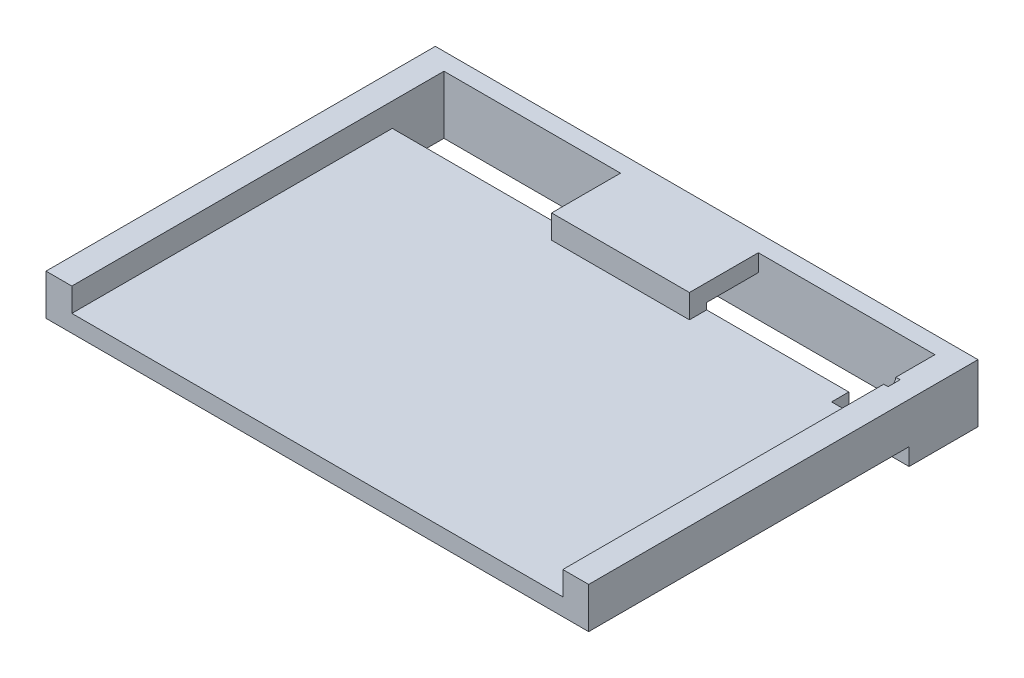
ISO-10303-21;
HEADER;
FILE_DESCRIPTION(('STEP AP214'),'2;1');
FILE_NAME('part.step','',(''),(''),'','','');
FILE_SCHEMA(('AUTOMOTIVE_DESIGN { 1 0 10303 214 1 1 1 1 }'));
ENDSEC;
DATA;
#1=APPLICATION_CONTEXT('core data for automotive mechanical design processes');
#2=APPLICATION_PROTOCOL_DEFINITION('international standard','automotive_design',2000,#1);
#3=PRODUCT_CONTEXT('',#1,'mechanical');
#4=PRODUCT('Part','Part','',(#3));
#5=PRODUCT_RELATED_PRODUCT_CATEGORY('part','',(#4));
#6=PRODUCT_DEFINITION_FORMATION('','',#4);
#7=PRODUCT_DEFINITION_CONTEXT('part definition',#1,'design');
#8=PRODUCT_DEFINITION('design','',#6,#7);
#9=PRODUCT_DEFINITION_SHAPE('','',#8);
#10=(LENGTH_UNIT() NAMED_UNIT(*) SI_UNIT(.MILLI.,.METRE.));
#11=(NAMED_UNIT(*) PLANE_ANGLE_UNIT() SI_UNIT($,.RADIAN.));
#12=(NAMED_UNIT(*) SI_UNIT($,.STERADIAN.) SOLID_ANGLE_UNIT());
#13=UNCERTAINTY_MEASURE_WITH_UNIT(LENGTH_MEASURE(1.E-05),#10,'distance_accuracy_value','');
#14=(GEOMETRIC_REPRESENTATION_CONTEXT(3) GLOBAL_UNCERTAINTY_ASSIGNED_CONTEXT((#13)) GLOBAL_UNIT_ASSIGNED_CONTEXT((#10,
#11,#12)) REPRESENTATION_CONTEXT('',''));
#15=CARTESIAN_POINT('',(0.,0.,0.));
#16=DIRECTION('',(0.,0.,1.));
#17=DIRECTION('',(1.,0.,0.));
#18=AXIS2_PLACEMENT_3D('',#15,#16,#17);
#19=CARTESIAN_POINT('',(0.,6.75,0.));
#20=DIRECTION('',(0.,1.,0.));
#21=DIRECTION('',(0.,0.,1.));
#22=AXIS2_PLACEMENT_3D('',#19,#20,#21);
#23=PLANE('',#22);
#24=DIRECTION('',(0.,0.,-1.));
#25=VECTOR('',#24,1.);
#26=CARTESIAN_POINT('',(28.5,6.75,-20.6));
#27=LINE('',#26,#25);
#28=CARTESIAN_POINT('',(28.5,6.75,-16.0573118588748));
#29=VERTEX_POINT('',#28);
#30=CARTESIAN_POINT('',(28.5,6.75,-20.6));
#31=VERTEX_POINT('',#30);
#32=EDGE_CURVE('E251',#29,#31,#27,.T.);
#33=ORIENTED_EDGE('',*,*,#32,.F.);
#34=DIRECTION('',(-1.,0.,0.));
#35=VECTOR('',#34,1.);
#36=CARTESIAN_POINT('',(29.,6.75,-16.0573118588748));
#37=LINE('',#36,#35);
#38=CARTESIAN_POINT('',(29.,6.75,-16.0573118588748));
#39=VERTEX_POINT('',#38);
#40=EDGE_CURVE('E52',#29,#39,#37,.F.);
#41=ORIENTED_EDGE('',*,*,#40,.T.);
#42=DIRECTION('',(0.,0.,-1.));
#43=VECTOR('',#42,1.);
#44=CARTESIAN_POINT('',(29.,6.75,0.));
#45=LINE('',#44,#43);
#46=CARTESIAN_POINT('',(29.,6.75,-14.6608878544979));
#47=VERTEX_POINT('',#46);
#48=EDGE_CURVE('E12',#47,#39,#45,.T.);
#49=ORIENTED_EDGE('',*,*,#48,.F.);
#50=DIRECTION('',(-1.,0.,0.));
#51=VECTOR('',#50,1.);
#52=CARTESIAN_POINT('',(29.,6.75,-14.6608878544979));
#53=LINE('',#52,#51);
#54=CARTESIAN_POINT('',(28.5,6.75,-14.6608878544979));
#55=VERTEX_POINT('',#54);
#56=EDGE_CURVE('E236',#47,#55,#53,.T.);
#57=ORIENTED_EDGE('',*,*,#56,.T.);
#58=CARTESIAN_POINT('',(28.5,6.75,22.6));
#59=VERTEX_POINT('',#58);
#60=EDGE_CURVE('E376',#59,#55,#27,.T.);
#61=ORIENTED_EDGE('',*,*,#60,.F.);
#62=DIRECTION('',(1.,0.,0.));
#63=VECTOR('',#62,1.);
#64=CARTESIAN_POINT('',(-31.5,6.75,22.6));
#65=LINE('',#64,#63);
#66=CARTESIAN_POINT('',(31.5,6.75,22.6));
#67=VERTEX_POINT('',#66);
#68=EDGE_CURVE('E436',#59,#67,#65,.T.);
#69=ORIENTED_EDGE('',*,*,#68,.T.);
#70=DIRECTION('',(0.,0.,-1.));
#71=VECTOR('',#70,1.);
#72=CARTESIAN_POINT('',(31.5,6.75,-22.6));
#73=LINE('',#72,#71);
#74=CARTESIAN_POINT('',(31.5,6.75,-22.6));
#75=VERTEX_POINT('',#74);
#76=EDGE_CURVE('E441',#67,#75,#73,.T.);
#77=ORIENTED_EDGE('',*,*,#76,.T.);
#78=DIRECTION('',(-1.,0.,0.));
#79=VECTOR('',#78,1.);
#80=CARTESIAN_POINT('',(-31.5,6.75,-22.6));
#81=LINE('',#80,#79);
#82=CARTESIAN_POINT('',(-31.5,6.75,-22.6));
#83=VERTEX_POINT('',#82);
#84=EDGE_CURVE('E443',#75,#83,#81,.T.);
#85=ORIENTED_EDGE('',*,*,#84,.T.);
#86=DIRECTION('',(0.,0.,1.));
#87=VECTOR('',#86,1.);
#88=CARTESIAN_POINT('',(-31.5,6.75,-22.6));
#89=LINE('',#88,#87);
#90=CARTESIAN_POINT('',(-31.5,6.75,22.6));
#91=VERTEX_POINT('',#90);
#92=EDGE_CURVE('E433',#83,#91,#89,.T.);
#93=ORIENTED_EDGE('',*,*,#92,.T.);
#94=CARTESIAN_POINT('',(-28.5,6.75,22.6));
#95=VERTEX_POINT('',#94);
#96=EDGE_CURVE('E438',#91,#95,#65,.T.);
#97=ORIENTED_EDGE('',*,*,#96,.T.);
#98=DIRECTION('',(0.,0.,1.));
#99=VECTOR('',#98,1.);
#100=CARTESIAN_POINT('',(-28.5,6.75,-20.6));
#101=LINE('',#100,#99);
#102=CARTESIAN_POINT('',(-28.5,6.75,-20.6));
#103=VERTEX_POINT('',#102);
#104=EDGE_CURVE('E361',#103,#95,#101,.T.);
#105=ORIENTED_EDGE('',*,*,#104,.F.);
#106=DIRECTION('',(-1.,0.,0.));
#107=VECTOR('',#106,1.);
#108=CARTESIAN_POINT('',(-28.5,6.75,-20.6));
#109=LINE('',#108,#107);
#110=CARTESIAN_POINT('',(-8.,6.75,-20.6));
#111=VERTEX_POINT('',#110);
#112=EDGE_CURVE('E362',#111,#103,#109,.T.);
#113=ORIENTED_EDGE('',*,*,#112,.F.);
#114=DIRECTION('',(0.,0.,-1.));
#115=VECTOR('',#114,1.);
#116=CARTESIAN_POINT('',(-8.,6.75,-20.6));
#117=LINE('',#116,#115);
#118=CARTESIAN_POINT('',(-8.,6.75,-12.6));
#119=VERTEX_POINT('',#118);
#120=EDGE_CURVE('E365',#119,#111,#117,.T.);
#121=ORIENTED_EDGE('',*,*,#120,.F.);
#122=DIRECTION('',(-1.,0.,0.));
#123=VECTOR('',#122,1.);
#124=CARTESIAN_POINT('',(-8.,6.75,-12.6));
#125=LINE('',#124,#123);
#126=CARTESIAN_POINT('',(8.,6.75,-12.6));
#127=VERTEX_POINT('',#126);
#128=EDGE_CURVE('E368',#127,#119,#125,.T.);
#129=ORIENTED_EDGE('',*,*,#128,.F.);
#130=DIRECTION('',(0.,0.,1.));
#131=VECTOR('',#130,1.);
#132=CARTESIAN_POINT('',(8.,6.75,-20.6));
#133=LINE('',#132,#131);
#134=CARTESIAN_POINT('',(8.,6.75,-20.6));
#135=VERTEX_POINT('',#134);
#136=EDGE_CURVE('E371',#135,#127,#133,.T.);
#137=ORIENTED_EDGE('',*,*,#136,.F.);
#138=DIRECTION('',(-1.,0.,0.));
#139=VECTOR('',#138,1.);
#140=CARTESIAN_POINT('',(8.,6.75,-20.6));
#141=LINE('',#140,#139);
#142=EDGE_CURVE('E373',#31,#135,#141,.T.);
#143=ORIENTED_EDGE('',*,*,#142,.F.);
#144=EDGE_LOOP('',(#33,#41,#49,#57,#61,#69,#77,#85,#93,#97,#105,#113,#121,#129,#137,#143));
#145=FACE_BOUND('',#144,.T.);
#146=ADVANCED_FACE('F37',(#145),#23,.T.);
#147=CARTESIAN_POINT('',(28.5,-69.5209060345295,-20.6));
#148=DIRECTION('',(1.,0.,0.));
#149=DIRECTION('',(0.,0.,-1.));
#150=AXIS2_PLACEMENT_3D('',#147,#148,#149);
#151=PLANE('',#150);
#152=CARTESIAN_POINT('',(28.5,6.8,-15.3590998566864));
#153=DIRECTION('',(1.,0.,0.));
#154=DIRECTION('',(0.,0.,-1.));
#155=AXIS2_PLACEMENT_3D('',#152,#153,#154);
#156=CIRCLE('',#155,0.699999999999996);
#157=EDGE_CURVE('E240',#55,#29,#156,.T.);
#158=ORIENTED_EDGE('',*,*,#157,.T.);
#159=ORIENTED_EDGE('',*,*,#32,.T.);
#160=DIRECTION('',(0.,1.,0.));
#161=VECTOR('',#160,1.);
#162=CARTESIAN_POINT('',(28.5,-69.5209060345295,-20.6));
#163=LINE('',#162,#161);
#164=CARTESIAN_POINT('',(28.5,0.,-20.6));
#165=VERTEX_POINT('',#164);
#166=EDGE_CURVE('E401',#165,#31,#163,.T.);
#167=ORIENTED_EDGE('',*,*,#166,.F.);
#168=DIRECTION('',(0.,-0.998629534754574,-0.0523359562429434));
#169=VECTOR('',#168,1.);
#170=CARTESIAN_POINT('',(28.5,4.75,-20.3510630484056));
#171=LINE('',#170,#169);
#172=CARTESIAN_POINT('',(28.5,4.75,-20.3510630484056));
#173=VERTEX_POINT('',#172);
#174=EDGE_CURVE('E315',#173,#165,#171,.T.);
#175=ORIENTED_EDGE('',*,*,#174,.F.);
#176=CARTESIAN_POINT('',(28.5,4.75,-19.2260630484056));
#177=DIRECTION('',(-1.,0.,0.));
#178=DIRECTION('',(0.,0.,1.));
#179=AXIS2_PLACEMENT_3D('',#176,#177,#178);
#180=CIRCLE('',#179,1.125);
#181=CARTESIAN_POINT('',(28.5,4.75,-18.1010630484056));
#182=VERTEX_POINT('',#181);
#183=EDGE_CURVE('E300',#182,#173,#180,.T.);
#184=ORIENTED_EDGE('',*,*,#183,.F.);
#185=DIRECTION('',(0.,0.998629534754574,-0.0523359562429434));
#186=VECTOR('',#185,1.);
#187=CARTESIAN_POINT('',(28.5,4.75,-18.1010630484056));
#188=LINE('',#187,#186);
#189=CARTESIAN_POINT('',(28.5,0.,-17.8521260968111));
#190=VERTEX_POINT('',#189);
#191=EDGE_CURVE('E305',#190,#182,#188,.T.);
#192=ORIENTED_EDGE('',*,*,#191,.F.);
#193=DIRECTION('',(0.,0.,1.));
#194=VECTOR('',#193,1.);
#195=CARTESIAN_POINT('',(28.5,0.,-20.6));
#196=LINE('',#195,#194);
#197=CARTESIAN_POINT('',(28.5,0.,-16.5690153801852));
#198=VERTEX_POINT('',#197);
#199=EDGE_CURVE('E345',#190,#198,#196,.T.);
#200=ORIENTED_EDGE('',*,*,#199,.T.);
#201=DIRECTION('',(0.,-0.998629534754574,-0.052335956242944));
#202=VECTOR('',#201,1.);
#203=CARTESIAN_POINT('',(28.5,2.29186876499435,-16.4489036278037));
#204=LINE('',#203,#202);
#205=CARTESIAN_POINT('',(28.5,2.29186876499435,-16.4489036278037));
#206=VERTEX_POINT('',#205);
#207=EDGE_CURVE('E262',#206,#198,#204,.T.);
#208=ORIENTED_EDGE('',*,*,#207,.F.);
#209=CARTESIAN_POINT('',(28.5,2.25,-15.65));
#210=DIRECTION('',(-1.,0.,0.));
#211=DIRECTION('',(0.,0.,1.));
#212=AXIS2_PLACEMENT_3D('',#209,#210,#211);
#213=CIRCLE('',#212,0.799999999999997);
#214=CARTESIAN_POINT('',(28.5,2.63509684406864,-14.948786465698));
#215=VERTEX_POINT('',#214);
#216=EDGE_CURVE('E255',#215,#206,#213,.T.);
#217=ORIENTED_EDGE('',*,*,#216,.F.);
#218=DIRECTION('',(0.,0.876516917877563,-0.481371055085802));
#219=VECTOR('',#218,1.);
#220=CARTESIAN_POINT('',(28.5,2.,-14.6));
#221=LINE('',#220,#219);
#222=CARTESIAN_POINT('',(28.5,2.,-14.6));
#223=VERTEX_POINT('',#222);
#224=EDGE_CURVE('E252',#223,#215,#221,.T.);
#225=ORIENTED_EDGE('',*,*,#224,.F.);
#226=DIRECTION('',(0.,0.,1.));
#227=VECTOR('',#226,1.);
#228=CARTESIAN_POINT('',(28.5,2.,0.));
#229=LINE('',#228,#227);
#230=CARTESIAN_POINT('',(28.5,2.,-12.6));
#231=VERTEX_POINT('',#230);
#232=EDGE_CURVE('E293',#223,#231,#229,.T.);
#233=ORIENTED_EDGE('',*,*,#232,.T.);
#234=DIRECTION('',(0.,1.,0.));
#235=VECTOR('',#234,1.);
#236=CARTESIAN_POINT('',(28.5,0.,-12.6));
#237=LINE('',#236,#235);
#238=CARTESIAN_POINT('',(28.5,4.,-12.6));
#239=VERTEX_POINT('',#238);
#240=EDGE_CURVE('E291',#231,#239,#237,.T.);
#241=ORIENTED_EDGE('',*,*,#240,.T.);
#242=DIRECTION('',(0.,0.,-1.));
#243=VECTOR('',#242,1.);
#244=CARTESIAN_POINT('',(28.5,4.,-20.6));
#245=LINE('',#244,#243);
#246=CARTESIAN_POINT('',(28.5,3.99999999999998,22.6));
#247=VERTEX_POINT('',#246);
#248=EDGE_CURVE('E398',#247,#239,#245,.T.);
#249=ORIENTED_EDGE('',*,*,#248,.F.);
#250=DIRECTION('',(0.,1.,0.));
#251=VECTOR('',#250,1.);
#252=CARTESIAN_POINT('',(28.5,-69.5209060345295,22.6));
#253=LINE('',#252,#251);
#254=EDGE_CURVE('E381',#247,#59,#253,.T.);
#255=ORIENTED_EDGE('',*,*,#254,.T.);
#256=ORIENTED_EDGE('',*,*,#60,.T.);
#257=EDGE_LOOP('',(#158,#159,#167,#175,#184,#192,#200,#208,#217,#225,#233,#241,#249,#255,#256));
#258=FACE_BOUND('',#257,.T.);
#259=ADVANCED_FACE('F483',(#258),#151,.F.);
#260=CARTESIAN_POINT('',(31.5,2.,-14.6));
#261=DIRECTION('',(0.,0.,-1.));
#262=DIRECTION('',(-1.,0.,0.));
#263=AXIS2_PLACEMENT_3D('',#260,#261,#262);
#264=PLANE('',#263);
#265=DIRECTION('',(0.,1.,0.));
#266=VECTOR('',#265,1.);
#267=CARTESIAN_POINT('',(29.,2.,-14.6));
#268=LINE('',#267,#266);
#269=CARTESIAN_POINT('',(29.,0.,-14.6));
#270=VERTEX_POINT('',#269);
#271=CARTESIAN_POINT('',(29.,2.,-14.6));
#272=VERTEX_POINT('',#271);
#273=EDGE_CURVE('E261',#270,#272,#268,.T.);
#274=ORIENTED_EDGE('',*,*,#273,.F.);
#275=DIRECTION('',(1.,0.,0.));
#276=VECTOR('',#275,1.);
#277=CARTESIAN_POINT('',(31.5,0.,-14.6));
#278=LINE('',#277,#276);
#279=CARTESIAN_POINT('',(31.5,0.,-14.6));
#280=VERTEX_POINT('',#279);
#281=EDGE_CURVE('E414',#270,#280,#278,.T.);
#282=ORIENTED_EDGE('',*,*,#281,.T.);
#283=DIRECTION('',(0.,-1.,0.));
#284=VECTOR('',#283,1.);
#285=CARTESIAN_POINT('',(31.5,2.,-14.6));
#286=LINE('',#285,#284);
#287=CARTESIAN_POINT('',(31.5,2.,-14.6));
#288=VERTEX_POINT('',#287);
#289=EDGE_CURVE('E428',#288,#280,#286,.T.);
#290=ORIENTED_EDGE('',*,*,#289,.F.);
#291=DIRECTION('',(1.,0.,0.));
#292=VECTOR('',#291,1.);
#293=CARTESIAN_POINT('',(31.5,2.,-14.6));
#294=LINE('',#293,#292);
#295=EDGE_CURVE('E422',#272,#288,#294,.T.);
#296=ORIENTED_EDGE('',*,*,#295,.F.);
#297=EDGE_LOOP('',(#274,#282,#290,#296));
#298=FACE_BOUND('',#297,.T.);
#299=ADVANCED_FACE('F495',(#298),#264,.F.);
#300=CARTESIAN_POINT('',(-31.5,0.,-14.6));
#301=VERTEX_POINT('',#300);
#302=CARTESIAN_POINT('',(-28.5,0.,-14.6));
#303=VERTEX_POINT('',#302);
#304=EDGE_CURVE('E418',#301,#303,#278,.T.);
#305=ORIENTED_EDGE('',*,*,#304,.T.);
#306=DIRECTION('',(0.,-1.,0.));
#307=VECTOR('',#306,1.);
#308=CARTESIAN_POINT('',(-28.5,6.75,-14.6));
#309=LINE('',#308,#307);
#310=CARTESIAN_POINT('',(-28.5,2.,-14.6));
#311=VERTEX_POINT('',#310);
#312=EDGE_CURVE('E355',#311,#303,#309,.T.);
#313=ORIENTED_EDGE('',*,*,#312,.F.);
#314=CARTESIAN_POINT('',(-31.5,2.,-14.6));
#315=VERTEX_POINT('',#314);
#316=EDGE_CURVE('E423',#315,#311,#294,.T.);
#317=ORIENTED_EDGE('',*,*,#316,.F.);
#318=DIRECTION('',(0.,-1.,0.));
#319=VECTOR('',#318,1.);
#320=CARTESIAN_POINT('',(-31.5,2.,-14.6));
#321=LINE('',#320,#319);
#322=EDGE_CURVE('E425',#315,#301,#321,.T.);
#323=ORIENTED_EDGE('',*,*,#322,.T.);
#324=EDGE_LOOP('',(#305,#313,#317,#323));
#325=FACE_BOUND('',#324,.T.);
#326=ADVANCED_FACE('F516',(#325),#264,.F.);
#327=CARTESIAN_POINT('',(-31.5,6.75,22.6));
#328=DIRECTION('',(0.,0.,-1.));
#329=DIRECTION('',(-1.,0.,0.));
#330=AXIS2_PLACEMENT_3D('',#327,#328,#329);
#331=PLANE('',#330);
#332=ORIENTED_EDGE('',*,*,#68,.F.);
#333=ORIENTED_EDGE('',*,*,#254,.F.);
#334=DIRECTION('',(1.,0.,0.));
#335=VECTOR('',#334,1.);
#336=CARTESIAN_POINT('',(-28.5,4.,22.6));
#337=LINE('',#336,#335);
#338=CARTESIAN_POINT('',(-28.5,4.,22.6));
#339=VERTEX_POINT('',#338);
#340=EDGE_CURVE('E364',#339,#247,#337,.T.);
#341=ORIENTED_EDGE('',*,*,#340,.F.);
#342=DIRECTION('',(0.,1.,0.));
#343=VECTOR('',#342,1.);
#344=CARTESIAN_POINT('',(-28.5,-69.5209060345295,22.6));
#345=LINE('',#344,#343);
#346=EDGE_CURVE('E384',#339,#95,#345,.T.);
#347=ORIENTED_EDGE('',*,*,#346,.T.);
#348=ORIENTED_EDGE('',*,*,#96,.F.);
#349=DIRECTION('',(0.,-1.,0.));
#350=VECTOR('',#349,1.);
#351=CARTESIAN_POINT('',(-31.5,6.75,22.6));
#352=LINE('',#351,#350);
#353=CARTESIAN_POINT('',(-31.5,2.,22.6));
#354=VERTEX_POINT('',#353);
#355=EDGE_CURVE('E459',#91,#354,#352,.T.);
#356=ORIENTED_EDGE('',*,*,#355,.T.);
#357=DIRECTION('',(-1.,0.,0.));
#358=VECTOR('',#357,1.);
#359=CARTESIAN_POINT('',(31.5,2.,22.6));
#360=LINE('',#359,#358);
#361=CARTESIAN_POINT('',(31.5,2.,22.6));
#362=VERTEX_POINT('',#361);
#363=EDGE_CURVE('E417',#362,#354,#360,.T.);
#364=ORIENTED_EDGE('',*,*,#363,.F.);
#365=DIRECTION('',(0.,-1.,0.));
#366=VECTOR('',#365,1.);
#367=CARTESIAN_POINT('',(31.5,6.75,22.6));
#368=LINE('',#367,#366);
#369=EDGE_CURVE('E456',#67,#362,#368,.T.);
#370=ORIENTED_EDGE('',*,*,#369,.F.);
#371=EDGE_LOOP('',(#332,#333,#341,#347,#348,#356,#364,#370));
#372=FACE_BOUND('',#371,.T.);
#373=ADVANCED_FACE('F505',(#372),#331,.F.);
#374=CARTESIAN_POINT('',(-31.5,6.75,-22.6));
#375=DIRECTION('',(1.,0.,0.));
#376=DIRECTION('',(0.,0.,-1.));
#377=AXIS2_PLACEMENT_3D('',#374,#375,#376);
#378=PLANE('',#377);
#379=DIRECTION('',(0.,0.,1.));
#380=VECTOR('',#379,1.);
#381=CARTESIAN_POINT('',(-31.5,0.,-22.6));
#382=LINE('',#381,#380);
#383=CARTESIAN_POINT('',(-31.5,0.,-22.6));
#384=VERTEX_POINT('',#383);
#385=EDGE_CURVE('E431',#384,#301,#382,.T.);
#386=ORIENTED_EDGE('',*,*,#385,.T.);
#387=ORIENTED_EDGE('',*,*,#322,.F.);
#388=DIRECTION('',(0.,0.,-1.));
#389=VECTOR('',#388,1.);
#390=CARTESIAN_POINT('',(-31.5,2.,-14.6));
#391=LINE('',#390,#389);
#392=EDGE_CURVE('E420',#354,#315,#391,.T.);
#393=ORIENTED_EDGE('',*,*,#392,.F.);
#394=ORIENTED_EDGE('',*,*,#355,.F.);
#395=ORIENTED_EDGE('',*,*,#92,.F.);
#396=DIRECTION('',(0.,-1.,0.));
#397=VECTOR('',#396,1.);
#398=CARTESIAN_POINT('',(-31.5,6.75,-22.6));
#399=LINE('',#398,#397);
#400=EDGE_CURVE('E445',#83,#384,#399,.T.);
#401=ORIENTED_EDGE('',*,*,#400,.T.);
#402=EDGE_LOOP('',(#386,#387,#393,#394,#395,#401));
#403=FACE_BOUND('',#402,.T.);
#404=ADVANCED_FACE('F39',(#403),#378,.F.);
#405=CARTESIAN_POINT('',(31.5,6.75,-22.6));
#406=DIRECTION('',(-1.,0.,0.));
#407=DIRECTION('',(0.,0.,1.));
#408=AXIS2_PLACEMENT_3D('',#405,#406,#407);
#409=PLANE('',#408);
#410=DIRECTION('',(0.,0.,1.));
#411=VECTOR('',#410,1.);
#412=CARTESIAN_POINT('',(31.5,2.,-14.6));
#413=LINE('',#412,#411);
#414=EDGE_CURVE('E415',#288,#362,#413,.T.);
#415=ORIENTED_EDGE('',*,*,#414,.F.);
#416=ORIENTED_EDGE('',*,*,#289,.T.);
#417=DIRECTION('',(0.,0.,-1.));
#418=VECTOR('',#417,1.);
#419=CARTESIAN_POINT('',(31.5,0.,-22.6));
#420=LINE('',#419,#418);
#421=CARTESIAN_POINT('',(31.5,0.,-22.6));
#422=VERTEX_POINT('',#421);
#423=EDGE_CURVE('E448',#280,#422,#420,.T.);
#424=ORIENTED_EDGE('',*,*,#423,.T.);
#425=DIRECTION('',(0.,-1.,0.));
#426=VECTOR('',#425,1.);
#427=CARTESIAN_POINT('',(31.5,6.75,-22.6));
#428=LINE('',#427,#426);
#429=EDGE_CURVE('E453',#75,#422,#428,.T.);
#430=ORIENTED_EDGE('',*,*,#429,.F.);
#431=ORIENTED_EDGE('',*,*,#76,.F.);
#432=ORIENTED_EDGE('',*,*,#369,.T.);
#433=EDGE_LOOP('',(#415,#416,#424,#430,#431,#432));
#434=FACE_BOUND('',#433,.T.);
#435=ADVANCED_FACE('F499',(#434),#409,.F.);
#436=CARTESIAN_POINT('',(-31.5,6.75,-22.6));
#437=DIRECTION('',(0.,0.,1.));
#438=DIRECTION('',(1.,0.,0.));
#439=AXIS2_PLACEMENT_3D('',#436,#437,#438);
#440=PLANE('',#439);
#441=DIRECTION('',(-1.,0.,0.));
#442=VECTOR('',#441,1.);
#443=CARTESIAN_POINT('',(-31.5,0.,-22.6));
#444=LINE('',#443,#442);
#445=EDGE_CURVE('E437',#422,#384,#444,.T.);
#446=ORIENTED_EDGE('',*,*,#445,.T.);
#447=ORIENTED_EDGE('',*,*,#400,.F.);
#448=ORIENTED_EDGE('',*,*,#84,.F.);
#449=ORIENTED_EDGE('',*,*,#429,.T.);
#450=EDGE_LOOP('',(#446,#447,#448,#449));
#451=FACE_BOUND('',#450,.T.);
#452=ADVANCED_FACE('F559',(#451),#440,.F.);
#453=CARTESIAN_POINT('',(0.,0.,0.));
#454=DIRECTION('',(0.,1.,0.));
#455=DIRECTION('',(0.,0.,1.));
#456=AXIS2_PLACEMENT_3D('',#453,#454,#455);
#457=PLANE('',#456);
#458=DIRECTION('',(0.,0.,1.));
#459=VECTOR('',#458,1.);
#460=CARTESIAN_POINT('',(29.,0.,-16.5690153801852));
#461=LINE('',#460,#459);
#462=CARTESIAN_POINT('',(29.,0.,-16.5690153801852));
#463=VERTEX_POINT('',#462);
#464=EDGE_CURVE('E259',#463,#270,#461,.T.);
#465=ORIENTED_EDGE('',*,*,#464,.F.);
#466=DIRECTION('',(-1.,0.,0.));
#467=VECTOR('',#466,1.);
#468=CARTESIAN_POINT('',(29.,0.,-16.5690153801852));
#469=LINE('',#468,#467);
#470=EDGE_CURVE('E278',#463,#198,#469,.T.);
#471=ORIENTED_EDGE('',*,*,#470,.T.);
#472=ORIENTED_EDGE('',*,*,#199,.F.);
#473=DIRECTION('',(-1.,0.,0.));
#474=VECTOR('',#473,1.);
#475=CARTESIAN_POINT('',(29.5,0.,-17.8521260968111));
#476=LINE('',#475,#474);
#477=CARTESIAN_POINT('',(29.5,0.,-17.8521260968111));
#478=VERTEX_POINT('',#477);
#479=EDGE_CURVE('E323',#478,#190,#476,.T.);
#480=ORIENTED_EDGE('',*,*,#479,.F.);
#481=DIRECTION('',(0.,0.,1.));
#482=VECTOR('',#481,1.);
#483=CARTESIAN_POINT('',(29.5,0.,-20.6));
#484=LINE('',#483,#482);
#485=CARTESIAN_POINT('',(29.5,0.,-20.6));
#486=VERTEX_POINT('',#485);
#487=EDGE_CURVE('E308',#486,#478,#484,.T.);
#488=ORIENTED_EDGE('',*,*,#487,.F.);
#489=DIRECTION('',(-1.,0.,0.));
#490=VECTOR('',#489,1.);
#491=CARTESIAN_POINT('',(29.5,0.,-20.6));
#492=LINE('',#491,#490);
#493=EDGE_CURVE('E325',#486,#165,#492,.T.);
#494=ORIENTED_EDGE('',*,*,#493,.T.);
#495=DIRECTION('',(1.,0.,0.));
#496=VECTOR('',#495,1.);
#497=CARTESIAN_POINT('',(-28.5,0.,-20.6));
#498=LINE('',#497,#496);
#499=CARTESIAN_POINT('',(-28.5,0.,-20.6));
#500=VERTEX_POINT('',#499);
#501=EDGE_CURVE('E353',#500,#165,#498,.T.);
#502=ORIENTED_EDGE('',*,*,#501,.F.);
#503=DIRECTION('',(0.,0.,-1.));
#504=VECTOR('',#503,1.);
#505=CARTESIAN_POINT('',(-28.5,0.,-20.6));
#506=LINE('',#505,#504);
#507=EDGE_CURVE('E350',#303,#500,#506,.T.);
#508=ORIENTED_EDGE('',*,*,#507,.F.);
#509=ORIENTED_EDGE('',*,*,#304,.F.);
#510=ORIENTED_EDGE('',*,*,#385,.F.);
#511=ORIENTED_EDGE('',*,*,#445,.F.);
#512=ORIENTED_EDGE('',*,*,#423,.F.);
#513=ORIENTED_EDGE('',*,*,#281,.F.);
#514=EDGE_LOOP('',(#465,#471,#472,#480,#488,#494,#502,#508,#509,#510,#511,#512,#513));
#515=FACE_BOUND('',#514,.T.);
#516=ADVANCED_FACE('F521',(#515),#457,.F.);
#517=CARTESIAN_POINT('',(0.,2.,0.));
#518=DIRECTION('',(0.,-1.,0.));
#519=DIRECTION('',(0.,0.,-1.));
#520=AXIS2_PLACEMENT_3D('',#517,#518,#519);
#521=PLANE('',#520);
#522=ORIENTED_EDGE('',*,*,#232,.F.);
#523=EDGE_CURVE('E480',#223,#272,#294,.T.);
#524=ORIENTED_EDGE('',*,*,#523,.T.);
#525=ORIENTED_EDGE('',*,*,#295,.T.);
#526=ORIENTED_EDGE('',*,*,#414,.T.);
#527=ORIENTED_EDGE('',*,*,#363,.T.);
#528=ORIENTED_EDGE('',*,*,#392,.T.);
#529=ORIENTED_EDGE('',*,*,#316,.T.);
#530=CARTESIAN_POINT('',(24.5,2.,-14.6));
#531=VERTEX_POINT('',#530);
#532=EDGE_CURVE('E60',#311,#531,#294,.T.);
#533=ORIENTED_EDGE('',*,*,#532,.T.);
#534=DIRECTION('',(0.,0.,-1.));
#535=VECTOR('',#534,1.);
#536=CARTESIAN_POINT('',(24.5,2.,0.));
#537=LINE('',#536,#535);
#538=CARTESIAN_POINT('',(24.5,2.,-12.6));
#539=VERTEX_POINT('',#538);
#540=EDGE_CURVE('E296',#539,#531,#537,.T.);
#541=ORIENTED_EDGE('',*,*,#540,.F.);
#542=DIRECTION('',(-1.,0.,0.));
#543=VECTOR('',#542,1.);
#544=CARTESIAN_POINT('',(0.,2.,-12.6));
#545=LINE('',#544,#543);
#546=EDGE_CURVE('E298',#231,#539,#545,.T.);
#547=ORIENTED_EDGE('',*,*,#546,.F.);
#548=EDGE_LOOP('',(#522,#524,#525,#526,#527,#528,#529,#533,#541,#547));
#549=FACE_BOUND('',#548,.T.);
#550=ADVANCED_FACE('F478',(#549),#521,.T.);
#551=CARTESIAN_POINT('',(0.,4.,0.));
#552=DIRECTION('',(0.,-1.,0.));
#553=DIRECTION('',(0.,0.,-1.));
#554=AXIS2_PLACEMENT_3D('',#551,#552,#553);
#555=PLANE('',#554);
#556=ORIENTED_EDGE('',*,*,#248,.T.);
#557=DIRECTION('',(1.,0.,0.));
#558=VECTOR('',#557,1.);
#559=CARTESIAN_POINT('',(24.5,4.,-12.6));
#560=LINE('',#559,#558);
#561=CARTESIAN_POINT('',(24.5,4.,-12.6));
#562=VERTEX_POINT('',#561);
#563=EDGE_CURVE('E287',#562,#239,#560,.T.);
#564=ORIENTED_EDGE('',*,*,#563,.F.);
#565=DIRECTION('',(0.,0.,1.));
#566=VECTOR('',#565,1.);
#567=CARTESIAN_POINT('',(24.5,4.,-12.6));
#568=LINE('',#567,#566);
#569=CARTESIAN_POINT('',(24.5,4.,-14.6));
#570=VERTEX_POINT('',#569);
#571=EDGE_CURVE('E281',#570,#562,#568,.T.);
#572=ORIENTED_EDGE('',*,*,#571,.F.);
#573=DIRECTION('',(-1.,0.,0.));
#574=VECTOR('',#573,1.);
#575=CARTESIAN_POINT('',(0.,4.,-14.6));
#576=LINE('',#575,#574);
#577=CARTESIAN_POINT('',(8.,3.99999999999998,-14.6));
#578=VERTEX_POINT('',#577);
#579=EDGE_CURVE('E348',#570,#578,#576,.T.);
#580=ORIENTED_EDGE('',*,*,#579,.T.);
#581=DIRECTION('',(0.,0.,1.));
#582=VECTOR('',#581,1.);
#583=CARTESIAN_POINT('',(8.,4.,-20.6));
#584=LINE('',#583,#582);
#585=CARTESIAN_POINT('',(8.,4.,-12.6));
#586=VERTEX_POINT('',#585);
#587=EDGE_CURVE('E395',#578,#586,#584,.T.);
#588=ORIENTED_EDGE('',*,*,#587,.T.);
#589=DIRECTION('',(-1.,0.,0.));
#590=VECTOR('',#589,1.);
#591=CARTESIAN_POINT('',(-8.,4.,-12.6));
#592=LINE('',#591,#590);
#593=CARTESIAN_POINT('',(-8.,4.,-12.6));
#594=VERTEX_POINT('',#593);
#595=EDGE_CURVE('E391',#586,#594,#592,.T.);
#596=ORIENTED_EDGE('',*,*,#595,.T.);
#597=DIRECTION('',(0.,0.,-1.));
#598=VECTOR('',#597,1.);
#599=CARTESIAN_POINT('',(-8.,4.,-20.6));
#600=LINE('',#599,#598);
#601=CARTESIAN_POINT('',(-8.,3.99999999999998,-14.6));
#602=VERTEX_POINT('',#601);
#603=EDGE_CURVE('E386',#594,#602,#600,.T.);
#604=ORIENTED_EDGE('',*,*,#603,.T.);
#605=DIRECTION('',(-1.,0.,0.));
#606=VECTOR('',#605,1.);
#607=CARTESIAN_POINT('',(0.,4.,-14.6));
#608=LINE('',#607,#606);
#609=CARTESIAN_POINT('',(-28.5,3.99999999999998,-14.6));
#610=VERTEX_POINT('',#609);
#611=EDGE_CURVE('E358',#602,#610,#608,.T.);
#612=ORIENTED_EDGE('',*,*,#611,.T.);
#613=DIRECTION('',(0.,0.,1.));
#614=VECTOR('',#613,1.);
#615=CARTESIAN_POINT('',(-28.5,4.,-20.6));
#616=LINE('',#615,#614);
#617=EDGE_CURVE('E382',#610,#339,#616,.T.);
#618=ORIENTED_EDGE('',*,*,#617,.T.);
#619=ORIENTED_EDGE('',*,*,#340,.T.);
#620=EDGE_LOOP('',(#556,#564,#572,#580,#588,#596,#604,#612,#618,#619));
#621=FACE_BOUND('',#620,.T.);
#622=ADVANCED_FACE('F472',(#621),#555,.F.);
#623=CARTESIAN_POINT('',(8.,-69.5209060345295,-20.6));
#624=DIRECTION('',(0.,0.,-1.));
#625=DIRECTION('',(-1.,0.,0.));
#626=AXIS2_PLACEMENT_3D('',#623,#624,#625);
#627=PLANE('',#626);
#628=ORIENTED_EDGE('',*,*,#501,.T.);
#629=ORIENTED_EDGE('',*,*,#166,.T.);
#630=ORIENTED_EDGE('',*,*,#142,.T.);
#631=DIRECTION('',(0.,1.,0.));
#632=VECTOR('',#631,1.);
#633=CARTESIAN_POINT('',(8.,-69.5209060345295,-20.6));
#634=LINE('',#633,#632);
#635=CARTESIAN_POINT('',(8.,4.75,-20.6));
#636=VERTEX_POINT('',#635);
#637=EDGE_CURVE('E397',#636,#135,#634,.T.);
#638=ORIENTED_EDGE('',*,*,#637,.F.);
#639=DIRECTION('',(1.,0.,0.));
#640=VECTOR('',#639,1.);
#641=CARTESIAN_POINT('',(8.,4.75,-20.6));
#642=LINE('',#641,#640);
#643=CARTESIAN_POINT('',(-8.,4.75,-20.6));
#644=VERTEX_POINT('',#643);
#645=EDGE_CURVE('E337',#644,#636,#642,.T.);
#646=ORIENTED_EDGE('',*,*,#645,.F.);
#647=DIRECTION('',(0.,1.,0.));
#648=VECTOR('',#647,1.);
#649=CARTESIAN_POINT('',(-8.,-69.5209060345295,-20.6));
#650=LINE('',#649,#648);
#651=EDGE_CURVE('E389',#644,#111,#650,.T.);
#652=ORIENTED_EDGE('',*,*,#651,.T.);
#653=ORIENTED_EDGE('',*,*,#112,.T.);
#654=DIRECTION('',(0.,1.,0.));
#655=VECTOR('',#654,1.);
#656=CARTESIAN_POINT('',(-28.5,-69.5209060345295,-20.6));
#657=LINE('',#656,#655);
#658=EDGE_CURVE('E385',#500,#103,#657,.T.);
#659=ORIENTED_EDGE('',*,*,#658,.F.);
#660=EDGE_LOOP('',(#628,#629,#630,#638,#646,#652,#653,#659));
#661=FACE_BOUND('',#660,.T.);
#662=ADVANCED_FACE('F544',(#661),#627,.F.);
#663=CARTESIAN_POINT('',(8.,-69.5209060345295,-20.6));
#664=DIRECTION('',(-1.,0.,0.));
#665=DIRECTION('',(0.,0.,1.));
#666=AXIS2_PLACEMENT_3D('',#663,#664,#665);
#667=PLANE('',#666);
#668=DIRECTION('',(0.,-1.,0.));
#669=VECTOR('',#668,1.);
#670=CARTESIAN_POINT('',(8.,23.8380074906351,-14.6));
#671=LINE('',#670,#669);
#672=CARTESIAN_POINT('',(8.,4.75,-14.6));
#673=VERTEX_POINT('',#672);
#674=EDGE_CURVE('E336',#673,#578,#671,.T.);
#675=ORIENTED_EDGE('',*,*,#674,.F.);
#676=DIRECTION('',(0.,0.,1.));
#677=VECTOR('',#676,1.);
#678=CARTESIAN_POINT('',(8.,4.75,-20.6));
#679=LINE('',#678,#677);
#680=EDGE_CURVE('E333',#636,#673,#679,.T.);
#681=ORIENTED_EDGE('',*,*,#680,.F.);
#682=ORIENTED_EDGE('',*,*,#637,.T.);
#683=ORIENTED_EDGE('',*,*,#136,.T.);
#684=DIRECTION('',(0.,1.,0.));
#685=VECTOR('',#684,1.);
#686=CARTESIAN_POINT('',(8.,-69.5209060345295,-12.6));
#687=LINE('',#686,#685);
#688=EDGE_CURVE('E394',#586,#127,#687,.T.);
#689=ORIENTED_EDGE('',*,*,#688,.F.);
#690=ORIENTED_EDGE('',*,*,#587,.F.);
#691=EDGE_LOOP('',(#675,#681,#682,#683,#689,#690));
#692=FACE_BOUND('',#691,.T.);
#693=ADVANCED_FACE('F552',(#692),#667,.F.);
#694=CARTESIAN_POINT('',(-8.,-69.5209060345295,-12.6));
#695=DIRECTION('',(0.,0.,-1.));
#696=DIRECTION('',(-1.,0.,0.));
#697=AXIS2_PLACEMENT_3D('',#694,#695,#696);
#698=PLANE('',#697);
#699=ORIENTED_EDGE('',*,*,#688,.T.);
#700=ORIENTED_EDGE('',*,*,#128,.T.);
#701=DIRECTION('',(0.,1.,0.));
#702=VECTOR('',#701,1.);
#703=CARTESIAN_POINT('',(-8.,-69.5209060345295,-12.6));
#704=LINE('',#703,#702);
#705=EDGE_CURVE('E390',#594,#119,#704,.T.);
#706=ORIENTED_EDGE('',*,*,#705,.F.);
#707=ORIENTED_EDGE('',*,*,#595,.F.);
#708=EDGE_LOOP('',(#699,#700,#706,#707));
#709=FACE_BOUND('',#708,.T.);
#710=ADVANCED_FACE('F537',(#709),#698,.F.);
#711=CARTESIAN_POINT('',(-8.,-69.5209060345295,-20.6));
#712=DIRECTION('',(1.,0.,0.));
#713=DIRECTION('',(0.,0.,-1.));
#714=AXIS2_PLACEMENT_3D('',#711,#712,#713);
#715=PLANE('',#714);
#716=ORIENTED_EDGE('',*,*,#651,.F.);
#717=DIRECTION('',(0.,0.,-1.));
#718=VECTOR('',#717,1.);
#719=CARTESIAN_POINT('',(-8.,4.75,-20.6));
#720=LINE('',#719,#718);
#721=CARTESIAN_POINT('',(-8.,4.75000000000001,-14.6));
#722=VERTEX_POINT('',#721);
#723=EDGE_CURVE('E339',#722,#644,#720,.T.);
#724=ORIENTED_EDGE('',*,*,#723,.F.);
#725=DIRECTION('',(0.,-1.,0.));
#726=VECTOR('',#725,1.);
#727=CARTESIAN_POINT('',(-8.,23.8380074906351,-14.6));
#728=LINE('',#727,#726);
#729=EDGE_CURVE('E332',#722,#602,#728,.T.);
#730=ORIENTED_EDGE('',*,*,#729,.T.);
#731=ORIENTED_EDGE('',*,*,#603,.F.);
#732=ORIENTED_EDGE('',*,*,#705,.T.);
#733=ORIENTED_EDGE('',*,*,#120,.T.);
#734=EDGE_LOOP('',(#716,#724,#730,#731,#732,#733));
#735=FACE_BOUND('',#734,.T.);
#736=ADVANCED_FACE('F534',(#735),#715,.F.);
#737=CARTESIAN_POINT('',(-28.5,-69.5209060345295,-20.6));
#738=DIRECTION('',(-1.,0.,0.));
#739=DIRECTION('',(0.,0.,1.));
#740=AXIS2_PLACEMENT_3D('',#737,#738,#739);
#741=PLANE('',#740);
#742=ORIENTED_EDGE('',*,*,#617,.F.);
#743=EDGE_CURVE('E357',#610,#311,#309,.T.);
#744=ORIENTED_EDGE('',*,*,#743,.T.);
#745=ORIENTED_EDGE('',*,*,#312,.T.);
#746=ORIENTED_EDGE('',*,*,#507,.T.);
#747=ORIENTED_EDGE('',*,*,#658,.T.);
#748=ORIENTED_EDGE('',*,*,#104,.T.);
#749=ORIENTED_EDGE('',*,*,#346,.F.);
#750=EDGE_LOOP('',(#742,#744,#745,#746,#747,#748,#749));
#751=FACE_BOUND('',#750,.T.);
#752=ADVANCED_FACE('F526',(#751),#741,.F.);
#753=CARTESIAN_POINT('',(-28.5,6.75,-14.6));
#754=DIRECTION('',(0.,0.,1.));
#755=DIRECTION('',(1.,0.,0.));
#756=AXIS2_PLACEMENT_3D('',#753,#754,#755);
#757=PLANE('',#756);
#758=ORIENTED_EDGE('',*,*,#674,.T.);
#759=ORIENTED_EDGE('',*,*,#579,.F.);
#760=DIRECTION('',(0.,-1.,0.));
#761=VECTOR('',#760,1.);
#762=CARTESIAN_POINT('',(24.5,6.75,-14.6));
#763=LINE('',#762,#761);
#764=EDGE_CURVE('E45',#570,#531,#763,.T.);
#765=ORIENTED_EDGE('',*,*,#764,.T.);
#766=ORIENTED_EDGE('',*,*,#532,.F.);
#767=ORIENTED_EDGE('',*,*,#743,.F.);
#768=ORIENTED_EDGE('',*,*,#611,.F.);
#769=ORIENTED_EDGE('',*,*,#729,.F.);
#770=DIRECTION('',(-1.,0.,0.));
#771=VECTOR('',#770,1.);
#772=CARTESIAN_POINT('',(8.,4.75,-14.6));
#773=LINE('',#772,#771);
#774=EDGE_CURVE('E322',#673,#722,#773,.T.);
#775=ORIENTED_EDGE('',*,*,#774,.F.);
#776=EDGE_LOOP('',(#758,#759,#765,#766,#767,#768,#769,#775));
#777=FACE_BOUND('',#776,.T.);
#778=ADVANCED_FACE('F464',(#777),#757,.F.);
#779=CARTESIAN_POINT('',(0.,4.75,0.));
#780=DIRECTION('',(0.,1.,0.));
#781=DIRECTION('',(0.,0.,1.));
#782=AXIS2_PLACEMENT_3D('',#779,#780,#781);
#783=PLANE('',#782);
#784=ORIENTED_EDGE('',*,*,#680,.T.);
#785=ORIENTED_EDGE('',*,*,#774,.T.);
#786=ORIENTED_EDGE('',*,*,#723,.T.);
#787=ORIENTED_EDGE('',*,*,#645,.T.);
#788=EDGE_LOOP('',(#784,#785,#786,#787));
#789=FACE_BOUND('',#788,.T.);
#790=ADVANCED_FACE('F548',(#789),#783,.F.);
#791=CARTESIAN_POINT('',(29.5,4.75,-19.2260630484056));
#792=DIRECTION('',(-1.,0.,0.));
#793=DIRECTION('',(0.,0.,1.));
#794=AXIS2_PLACEMENT_3D('',#791,#792,#793);
#795=CYLINDRICAL_SURFACE('',#794,1.125);
#796=ORIENTED_EDGE('',*,*,#183,.T.);
#797=DIRECTION('',(-1.,0.,0.));
#798=VECTOR('',#797,1.);
#799=CARTESIAN_POINT('',(29.5,4.75,-20.3510630484056));
#800=LINE('',#799,#798);
#801=CARTESIAN_POINT('',(29.5,4.75,-20.3510630484056));
#802=VERTEX_POINT('',#801);
#803=EDGE_CURVE('E313',#802,#173,#800,.T.);
#804=ORIENTED_EDGE('',*,*,#803,.F.);
#805=CARTESIAN_POINT('',(29.5,4.75,-19.2260630484056));
#806=DIRECTION('',(-1.,0.,0.));
#807=DIRECTION('',(0.,0.,1.));
#808=AXIS2_PLACEMENT_3D('',#805,#806,#807);
#809=CIRCLE('',#808,1.125);
#810=CARTESIAN_POINT('',(29.5,4.75,-18.1010630484056));
#811=VERTEX_POINT('',#810);
#812=EDGE_CURVE('E301',#811,#802,#809,.T.);
#813=ORIENTED_EDGE('',*,*,#812,.F.);
#814=DIRECTION('',(-1.,0.,0.));
#815=VECTOR('',#814,1.);
#816=CARTESIAN_POINT('',(29.5,4.75,-18.1010630484056));
#817=LINE('',#816,#815);
#818=EDGE_CURVE('E319',#811,#182,#817,.T.);
#819=ORIENTED_EDGE('',*,*,#818,.T.);
#820=EDGE_LOOP('',(#796,#804,#813,#819));
#821=FACE_BOUND('',#820,.T.);
#822=ADVANCED_FACE('F580',(#821),#795,.F.);
#823=CARTESIAN_POINT('',(29.5,4.75,-18.1010630484056));
#824=DIRECTION('',(0.,0.0523359562429434,0.998629534754574));
#825=DIRECTION('',(0.,-0.998629534754574,0.0523359562429434));
#826=AXIS2_PLACEMENT_3D('',#823,#824,#825);
#827=PLANE('',#826);
#828=ORIENTED_EDGE('',*,*,#191,.T.);
#829=ORIENTED_EDGE('',*,*,#818,.F.);
#830=DIRECTION('',(0.,0.998629534754574,-0.0523359562429434));
#831=VECTOR('',#830,1.);
#832=CARTESIAN_POINT('',(29.5,4.75,-18.1010630484056));
#833=LINE('',#832,#831);
#834=EDGE_CURVE('E310',#478,#811,#833,.T.);
#835=ORIENTED_EDGE('',*,*,#834,.F.);
#836=ORIENTED_EDGE('',*,*,#479,.T.);
#837=EDGE_LOOP('',(#828,#829,#835,#836));
#838=FACE_BOUND('',#837,.T.);
#839=ADVANCED_FACE('F572',(#838),#827,.F.);
#840=CARTESIAN_POINT('',(29.5,4.75,-20.3510630484056));
#841=DIRECTION('',(0.,0.0523359562429434,-0.998629534754574));
#842=DIRECTION('',(0.,0.998629534754574,0.0523359562429434));
#843=AXIS2_PLACEMENT_3D('',#840,#841,#842);
#844=PLANE('',#843);
#845=ORIENTED_EDGE('',*,*,#174,.T.);
#846=ORIENTED_EDGE('',*,*,#493,.F.);
#847=DIRECTION('',(0.,-0.998629534754574,-0.0523359562429434));
#848=VECTOR('',#847,1.);
#849=CARTESIAN_POINT('',(29.5,4.75,-20.3510630484056));
#850=LINE('',#849,#848);
#851=EDGE_CURVE('E304',#802,#486,#850,.T.);
#852=ORIENTED_EDGE('',*,*,#851,.F.);
#853=ORIENTED_EDGE('',*,*,#803,.T.);
#854=EDGE_LOOP('',(#845,#846,#852,#853));
#855=FACE_BOUND('',#854,.T.);
#856=ADVANCED_FACE('F578',(#855),#844,.F.);
#857=CARTESIAN_POINT('',(29.5,4.75,-19.2260630484056));
#858=DIRECTION('',(-1.,0.,0.));
#859=DIRECTION('',(0.,0.,1.));
#860=AXIS2_PLACEMENT_3D('',#857,#858,#859);
#861=PLANE('',#860);
#862=ORIENTED_EDGE('',*,*,#812,.T.);
#863=ORIENTED_EDGE('',*,*,#851,.T.);
#864=ORIENTED_EDGE('',*,*,#487,.T.);
#865=ORIENTED_EDGE('',*,*,#834,.T.);
#866=EDGE_LOOP('',(#862,#863,#864,#865));
#867=FACE_BOUND('',#866,.T.);
#868=ADVANCED_FACE('F575',(#867),#861,.T.);
#869=CARTESIAN_POINT('',(24.5,0.,-12.6));
#870=DIRECTION('',(0.,0.,1.));
#871=DIRECTION('',(1.,0.,0.));
#872=AXIS2_PLACEMENT_3D('',#869,#870,#871);
#873=PLANE('',#872);
#874=ORIENTED_EDGE('',*,*,#546,.T.);
#875=DIRECTION('',(0.,1.,0.));
#876=VECTOR('',#875,1.);
#877=CARTESIAN_POINT('',(24.5,0.,-12.6));
#878=LINE('',#877,#876);
#879=EDGE_CURVE('E290',#539,#562,#878,.T.);
#880=ORIENTED_EDGE('',*,*,#879,.T.);
#881=ORIENTED_EDGE('',*,*,#563,.T.);
#882=ORIENTED_EDGE('',*,*,#240,.F.);
#883=EDGE_LOOP('',(#874,#880,#881,#882));
#884=FACE_BOUND('',#883,.T.);
#885=ADVANCED_FACE('F475',(#884),#873,.F.);
#886=CARTESIAN_POINT('',(24.5,0.,-12.6));
#887=DIRECTION('',(-1.,0.,0.));
#888=DIRECTION('',(0.,0.,1.));
#889=AXIS2_PLACEMENT_3D('',#886,#887,#888);
#890=PLANE('',#889);
#891=ORIENTED_EDGE('',*,*,#540,.T.);
#892=ORIENTED_EDGE('',*,*,#764,.F.);
#893=ORIENTED_EDGE('',*,*,#571,.T.);
#894=ORIENTED_EDGE('',*,*,#879,.F.);
#895=EDGE_LOOP('',(#891,#892,#893,#894));
#896=FACE_BOUND('',#895,.T.);
#897=ADVANCED_FACE('F468',(#896),#890,.F.);
#898=CARTESIAN_POINT('',(29.,2.29186876499435,-16.4489036278037));
#899=DIRECTION('',(0.,0.052335956242944,-0.998629534754574));
#900=DIRECTION('',(0.,0.998629534754574,0.0523359562429441));
#901=AXIS2_PLACEMENT_3D('',#898,#899,#900);
#902=PLANE('',#901);
#903=ORIENTED_EDGE('',*,*,#207,.T.);
#904=ORIENTED_EDGE('',*,*,#470,.F.);
#905=DIRECTION('',(0.,-0.998629534754574,-0.052335956242944));
#906=VECTOR('',#905,1.);
#907=CARTESIAN_POINT('',(29.,2.29186876499435,-16.4489036278037));
#908=LINE('',#907,#906);
#909=CARTESIAN_POINT('',(29.,2.29186876499435,-16.4489036278037));
#910=VERTEX_POINT('',#909);
#911=EDGE_CURVE('E271',#910,#463,#908,.T.);
#912=ORIENTED_EDGE('',*,*,#911,.F.);
#913=DIRECTION('',(-1.,0.,0.));
#914=VECTOR('',#913,1.);
#915=CARTESIAN_POINT('',(29.,2.29186876499435,-16.4489036278037));
#916=LINE('',#915,#914);
#917=EDGE_CURVE('E282',#910,#206,#916,.T.);
#918=ORIENTED_EDGE('',*,*,#917,.T.);
#919=EDGE_LOOP('',(#903,#904,#912,#918));
#920=FACE_BOUND('',#919,.T.);
#921=ADVANCED_FACE('F566',(#920),#902,.F.);
#922=CARTESIAN_POINT('',(29.,2.25,-15.65));
#923=DIRECTION('',(-1.,0.,0.));
#924=DIRECTION('',(0.,0.,1.));
#925=AXIS2_PLACEMENT_3D('',#922,#923,#924);
#926=CYLINDRICAL_SURFACE('',#925,0.799999999999997);
#927=ORIENTED_EDGE('',*,*,#216,.T.);
#928=ORIENTED_EDGE('',*,*,#917,.F.);
#929=CARTESIAN_POINT('',(29.,2.25,-15.65));
#930=DIRECTION('',(-1.,0.,0.));
#931=DIRECTION('',(0.,0.,1.));
#932=AXIS2_PLACEMENT_3D('',#929,#930,#931);
#933=CIRCLE('',#932,0.799999999999997);
#934=CARTESIAN_POINT('',(29.,2.63509684406864,-14.948786465698));
#935=VERTEX_POINT('',#934);
#936=EDGE_CURVE('E268',#935,#910,#933,.T.);
#937=ORIENTED_EDGE('',*,*,#936,.F.);
#938=DIRECTION('',(-1.,0.,0.));
#939=VECTOR('',#938,1.);
#940=CARTESIAN_POINT('',(29.,2.63509684406864,-14.948786465698));
#941=LINE('',#940,#939);
#942=EDGE_CURVE('E273',#935,#215,#941,.T.);
#943=ORIENTED_EDGE('',*,*,#942,.T.);
#944=EDGE_LOOP('',(#927,#928,#937,#943));
#945=FACE_BOUND('',#944,.T.);
#946=ADVANCED_FACE('F649',(#945),#926,.F.);
#947=CARTESIAN_POINT('',(29.,2.,-14.6));
#948=DIRECTION('',(0.,0.481371055085802,0.876516917877563));
#949=DIRECTION('',(0.,-0.876516917877563,0.481371055085802));
#950=AXIS2_PLACEMENT_3D('',#947,#948,#949);
#951=PLANE('',#950);
#952=ORIENTED_EDGE('',*,*,#224,.T.);
#953=ORIENTED_EDGE('',*,*,#942,.F.);
#954=DIRECTION('',(0.,0.876516917877563,-0.481371055085802));
#955=VECTOR('',#954,1.);
#956=CARTESIAN_POINT('',(29.,2.,-14.6));
#957=LINE('',#956,#955);
#958=EDGE_CURVE('E265',#272,#935,#957,.T.);
#959=ORIENTED_EDGE('',*,*,#958,.F.);
#960=ORIENTED_EDGE('',*,*,#523,.F.);
#961=EDGE_LOOP('',(#952,#953,#959,#960));
#962=FACE_BOUND('',#961,.T.);
#963=ADVANCED_FACE('F487',(#962),#951,.F.);
#964=CARTESIAN_POINT('',(29.,2.25,-15.65));
#965=DIRECTION('',(-1.,0.,0.));
#966=DIRECTION('',(0.,0.,1.));
#967=AXIS2_PLACEMENT_3D('',#964,#965,#966);
#968=PLANE('',#967);
#969=ORIENTED_EDGE('',*,*,#464,.T.);
#970=ORIENTED_EDGE('',*,*,#273,.T.);
#971=ORIENTED_EDGE('',*,*,#958,.T.);
#972=ORIENTED_EDGE('',*,*,#936,.T.);
#973=ORIENTED_EDGE('',*,*,#911,.T.);
#974=EDGE_LOOP('',(#969,#970,#971,#972,#973));
#975=FACE_BOUND('',#974,.T.);
#976=ADVANCED_FACE('F563',(#975),#968,.T.);
#977=CARTESIAN_POINT('',(29.,6.8,-15.3590998566864));
#978=DIRECTION('',(-1.,0.,0.));
#979=DIRECTION('',(0.,0.,1.));
#980=AXIS2_PLACEMENT_3D('',#977,#978,#979);
#981=CYLINDRICAL_SURFACE('',#980,0.699999999999996);
#982=ORIENTED_EDGE('',*,*,#157,.F.);
#983=ORIENTED_EDGE('',*,*,#56,.F.);
#984=CARTESIAN_POINT('',(29.,6.8,-15.3590998566864));
#985=DIRECTION('',(1.,0.,0.));
#986=DIRECTION('',(0.,0.,-1.));
#987=AXIS2_PLACEMENT_3D('',#984,#985,#986);
#988=CIRCLE('',#987,0.699999999999996);
#989=EDGE_CURVE('E239',#47,#39,#988,.T.);
#990=ORIENTED_EDGE('',*,*,#989,.T.);
#991=ORIENTED_EDGE('',*,*,#40,.F.);
#992=EDGE_LOOP('',(#982,#983,#990,#991));
#993=FACE_BOUND('',#992,.T.);
#994=ADVANCED_FACE('F238',(#993),#981,.F.);
#995=CARTESIAN_POINT('',(29.,6.8,-15.3590998566864));
#996=DIRECTION('',(1.,0.,0.));
#997=DIRECTION('',(0.,0.,-1.));
#998=AXIS2_PLACEMENT_3D('',#995,#996,#997);
#999=PLANE('',#998);
#1000=ORIENTED_EDGE('',*,*,#48,.T.);
#1001=ORIENTED_EDGE('',*,*,#989,.F.);
#1002=EDGE_LOOP('',(#1000,#1001));
#1003=FACE_BOUND('',#1002,.T.);
#1004=ADVANCED_FACE('F247',(#1003),#999,.F.);
#1005=CLOSED_SHELL('',(#146,#259,#299,#326,#373,#404,#435,#452,#516,#550,#622,#662,#693,#710,
#736,#752,#778,#790,#822,#839,#856,#868,#885,#897,#921,#946,#963,#976,#994,#1004));
#1006=MANIFOLD_SOLID_BREP('B2',#1005);
#1007=ADVANCED_BREP_SHAPE_REPRESENTATION('',(#18,#1006),#14);
#1008=SHAPE_DEFINITION_REPRESENTATION(#9,#1007);
ENDSEC;
END-ISO-10303-21;
